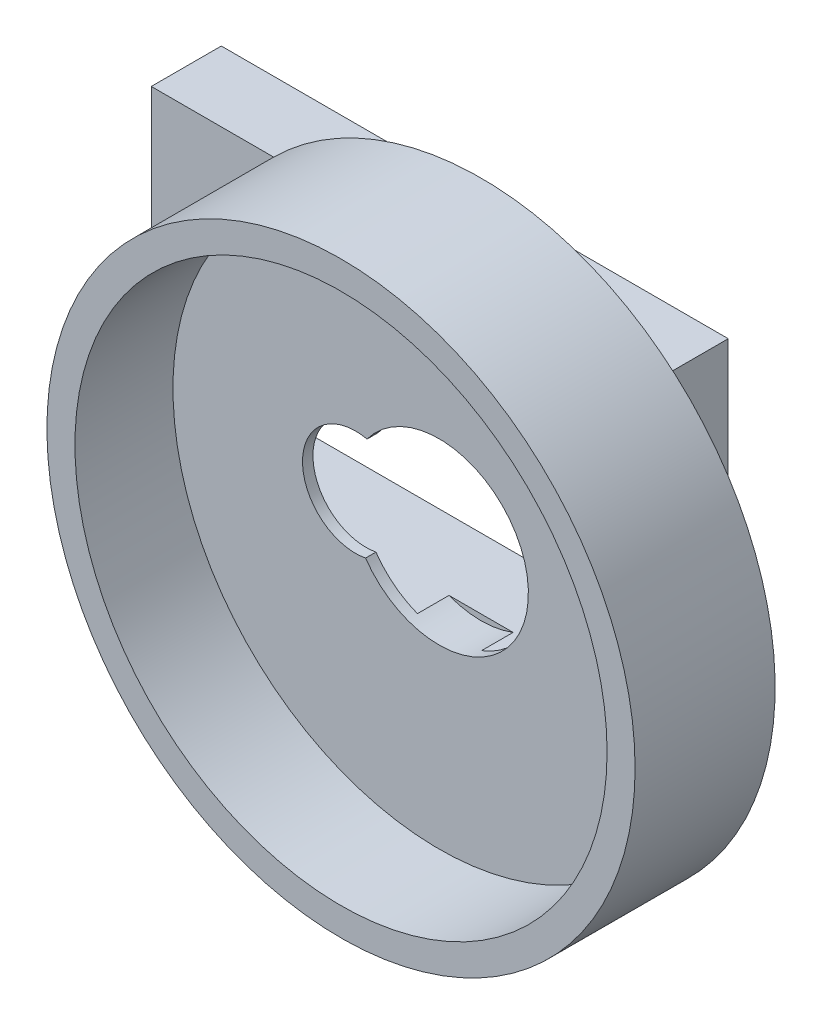
ISO-10303-21;
HEADER;
FILE_DESCRIPTION(('STEP AP214'),'2;1');
FILE_NAME('part.step','',(''),(''),'','','');
FILE_SCHEMA(('AUTOMOTIVE_DESIGN { 1 0 10303 214 1 1 1 1 }'));
ENDSEC;
DATA;
#1=APPLICATION_CONTEXT('core data for automotive mechanical design processes');
#2=APPLICATION_PROTOCOL_DEFINITION('international standard','automotive_design',2000,#1);
#3=PRODUCT_CONTEXT('',#1,'mechanical');
#4=PRODUCT('Part','Part','',(#3));
#5=PRODUCT_RELATED_PRODUCT_CATEGORY('part','',(#4));
#6=PRODUCT_DEFINITION_FORMATION('','',#4);
#7=PRODUCT_DEFINITION_CONTEXT('part definition',#1,'design');
#8=PRODUCT_DEFINITION('design','',#6,#7);
#9=PRODUCT_DEFINITION_SHAPE('','',#8);
#10=(LENGTH_UNIT() NAMED_UNIT(*) SI_UNIT(.MILLI.,.METRE.));
#11=(NAMED_UNIT(*) PLANE_ANGLE_UNIT() SI_UNIT($,.RADIAN.));
#12=(NAMED_UNIT(*) SI_UNIT($,.STERADIAN.) SOLID_ANGLE_UNIT());
#13=UNCERTAINTY_MEASURE_WITH_UNIT(LENGTH_MEASURE(1.E-05),#10,'distance_accuracy_value','');
#14=(GEOMETRIC_REPRESENTATION_CONTEXT(3) GLOBAL_UNCERTAINTY_ASSIGNED_CONTEXT((#13)) GLOBAL_UNIT_ASSIGNED_CONTEXT((#10,
#11,#12)) REPRESENTATION_CONTEXT('',''));
#15=CARTESIAN_POINT('',(0.,0.,0.));
#16=DIRECTION('',(0.,0.,1.));
#17=DIRECTION('',(1.,0.,0.));
#18=AXIS2_PLACEMENT_3D('',#15,#16,#17);
#19=CARTESIAN_POINT('',(21.0499987006187,-8.97299963980913,5.));
#20=DIRECTION('',(0.,-1.,0.));
#21=DIRECTION('',(0.,0.,-1.));
#22=AXIS2_PLACEMENT_3D('',#19,#20,#21);
#23=PLANE('',#22);
#24=DIRECTION('',(0.,0.,1.));
#25=VECTOR('',#24,1.);
#26=CARTESIAN_POINT('',(-0.00469983662826703,-8.97299963980913,7.25));
#27=LINE('',#26,#25);
#28=CARTESIAN_POINT('',(-0.00469983662826357,-8.97299963980913,7.25651338028399));
#29=VERTEX_POINT('',#28);
#30=CARTESIAN_POINT('',(-0.00469983662826703,-8.97299963980913,7.25));
#31=VERTEX_POINT('',#30);
#32=EDGE_CURVE('E59',#29,#31,#27,.F.);
#33=ORIENTED_EDGE('',*,*,#32,.T.);
#34=DIRECTION('',(-1.,0.,0.));
#35=VECTOR('',#34,1.);
#36=CARTESIAN_POINT('',(21.0499987006187,-8.97299963980913,7.25));
#37=LINE('',#36,#35);
#38=CARTESIAN_POINT('',(-0.0609952392290839,-8.97299963980913,7.25));
#39=VERTEX_POINT('',#38);
#40=EDGE_CURVE('E233',#31,#39,#37,.T.);
#41=ORIENTED_EDGE('',*,*,#40,.T.);
#42=DIRECTION('',(0.,0.,1.));
#43=VECTOR('',#42,1.);
#44=CARTESIAN_POINT('',(-0.0609952392290839,-8.97299963980913,5.));
#45=LINE('',#44,#43);
#46=CARTESIAN_POINT('',(-0.0609952392290752,-8.97299963980913,4.99999988824129));
#47=VERTEX_POINT('',#46);
#48=EDGE_CURVE('E400',#39,#47,#45,.F.);
#49=ORIENTED_EDGE('',*,*,#48,.T.);
#50=DIRECTION('',(-1.,0.,0.));
#51=VECTOR('',#50,1.);
#52=CARTESIAN_POINT('',(21.0499987006187,-8.97299963980913,5.));
#53=LINE('',#52,#51);
#54=CARTESIAN_POINT('',(-7.00300000607967,-8.97299963980913,5.));
#55=VERTEX_POINT('',#54);
#56=EDGE_CURVE('E324',#47,#55,#53,.T.);
#57=ORIENTED_EDGE('',*,*,#56,.T.);
#58=DIRECTION('',(0.,0.,1.));
#59=VECTOR('',#58,1.);
#60=CARTESIAN_POINT('',(-7.00300000607967,-8.97299963980913,1.5));
#61=LINE('',#60,#59);
#62=CARTESIAN_POINT('',(-7.00300000607967,-8.97299963980913,1.5));
#63=VERTEX_POINT('',#62);
#64=EDGE_CURVE('E302',#63,#55,#61,.T.);
#65=ORIENTED_EDGE('',*,*,#64,.F.);
#66=DIRECTION('',(-1.,0.,0.));
#67=VECTOR('',#66,1.);
#68=CARTESIAN_POINT('',(-12.002999894321,-8.97299963980913,1.5));
#69=LINE('',#68,#67);
#70=CARTESIAN_POINT('',(-12.002999894321,-8.97299963980913,1.5));
#71=VERTEX_POINT('',#70);
#72=EDGE_CURVE('E300',#63,#71,#69,.T.);
#73=ORIENTED_EDGE('',*,*,#72,.T.);
#74=DIRECTION('',(0.,0.,-1.));
#75=VECTOR('',#74,1.);
#76=CARTESIAN_POINT('',(-12.002999894321,-8.97299963980913,5.));
#77=LINE('',#76,#75);
#78=CARTESIAN_POINT('',(-12.002999894321,-8.97299963980913,0.));
#79=VERTEX_POINT('',#78);
#80=EDGE_CURVE('E345',#71,#79,#77,.T.);
#81=ORIENTED_EDGE('',*,*,#80,.T.);
#82=DIRECTION('',(-1.,0.,0.));
#83=VECTOR('',#82,1.);
#84=CARTESIAN_POINT('',(21.0499987006187,-8.97299963980913,0.));
#85=LINE('',#84,#83);
#86=CARTESIAN_POINT('',(21.0499987006187,-8.97299963980913,0.));
#87=VERTEX_POINT('',#86);
#88=EDGE_CURVE('E334',#87,#79,#85,.T.);
#89=ORIENTED_EDGE('',*,*,#88,.F.);
#90=DIRECTION('',(0.,0.,-1.));
#91=VECTOR('',#90,1.);
#92=CARTESIAN_POINT('',(21.0499987006187,-8.97299963980913,5.));
#93=LINE('',#92,#91);
#94=CARTESIAN_POINT('',(21.0499987006187,-8.97299963980913,1.5));
#95=VERTEX_POINT('',#94);
#96=EDGE_CURVE('E347',#95,#87,#93,.T.);
#97=ORIENTED_EDGE('',*,*,#96,.F.);
#98=DIRECTION('',(-1.,0.,0.));
#99=VECTOR('',#98,1.);
#100=CARTESIAN_POINT('',(21.0499987006187,-8.97299963980913,1.5));
#101=LINE('',#100,#99);
#102=CARTESIAN_POINT('',(16.4916390715284,-8.97299963980913,1.5));
#103=VERTEX_POINT('',#102);
#104=EDGE_CURVE('E310',#95,#103,#101,.T.);
#105=ORIENTED_EDGE('',*,*,#104,.T.);
#106=DIRECTION('',(0.,0.,1.));
#107=VECTOR('',#106,1.);
#108=CARTESIAN_POINT('',(16.4916390715284,-8.97299963980913,1.5));
#109=LINE('',#108,#107);
#110=CARTESIAN_POINT('',(16.4916390715284,-8.97299963980913,7.25651338028399));
#111=VERTEX_POINT('',#110);
#112=EDGE_CURVE('E317',#103,#111,#109,.T.);
#113=ORIENTED_EDGE('',*,*,#112,.T.);
#114=DIRECTION('',(-1.,0.,0.));
#115=VECTOR('',#114,1.);
#116=CARTESIAN_POINT('',(29.0677361462107,-8.97299963980913,7.25651338028399));
#117=LINE('',#116,#115);
#118=EDGE_CURVE('E268',#111,#29,#117,.T.);
#119=ORIENTED_EDGE('',*,*,#118,.T.);
#120=EDGE_LOOP('',(#33,#41,#49,#57,#65,#73,#81,#89,#97,#105,#113,#119));
#121=FACE_BOUND('',#120,.T.);
#122=ADVANCED_FACE('F44',(#121),#23,.T.);
#123=CARTESIAN_POINT('',(21.0499987006187,-21.3449988514185,5.));
#124=DIRECTION('',(0.,1.,0.));
#125=DIRECTION('',(0.,0.,1.));
#126=AXIS2_PLACEMENT_3D('',#123,#124,#125);
#127=PLANE('',#126);
#128=DIRECTION('',(0.,0.,1.));
#129=VECTOR('',#128,1.);
#130=CARTESIAN_POINT('',(-0.324902594661804,-21.3449988514185,5.));
#131=LINE('',#130,#129);
#132=CARTESIAN_POINT('',(-0.324902594661797,-21.3449988514185,4.99999988824129));
#133=VERTEX_POINT('',#132);
#134=CARTESIAN_POINT('',(-0.324902594661804,-21.3449988514185,7.25));
#135=VERTEX_POINT('',#134);
#136=EDGE_CURVE('E266',#133,#135,#131,.T.);
#137=ORIENTED_EDGE('',*,*,#136,.T.);
#138=DIRECTION('',(1.,0.,0.));
#139=VECTOR('',#138,1.);
#140=CARTESIAN_POINT('',(21.0499987006187,-21.3449988514185,7.25));
#141=LINE('',#140,#139);
#142=CARTESIAN_POINT('',(-0.269980564359586,-21.3449988514185,7.25));
#143=VERTEX_POINT('',#142);
#144=EDGE_CURVE('E67',#135,#143,#141,.T.);
#145=ORIENTED_EDGE('',*,*,#144,.T.);
#146=DIRECTION('',(0.,0.,1.));
#147=VECTOR('',#146,1.);
#148=CARTESIAN_POINT('',(-0.269980564359586,-21.3449988514185,7.25));
#149=LINE('',#148,#147);
#150=CARTESIAN_POINT('',(-0.269980564359586,-21.3449988514185,7.25651338028399));
#151=VERTEX_POINT('',#150);
#152=EDGE_CURVE('E228',#143,#151,#149,.T.);
#153=ORIENTED_EDGE('',*,*,#152,.T.);
#154=DIRECTION('',(-1.,0.,0.));
#155=VECTOR('',#154,1.);
#156=CARTESIAN_POINT('',(29.0677361462107,-21.3449988514185,7.25651338028399));
#157=LINE('',#156,#155);
#158=CARTESIAN_POINT('',(8.25926228249251,-21.3449988514185,7.25651338028399));
#159=VERTEX_POINT('',#158);
#160=EDGE_CURVE('E219',#159,#151,#157,.T.);
#161=ORIENTED_EDGE('',*,*,#160,.F.);
#162=DIRECTION('',(0.,0.,1.));
#163=VECTOR('',#162,1.);
#164=CARTESIAN_POINT('',(8.2592622824925,-21.3449988514185,5.));
#165=LINE('',#164,#163);
#166=CARTESIAN_POINT('',(8.25926228249251,-21.3449988514185,4.99999988824129));
#167=VERTEX_POINT('',#166);
#168=EDGE_CURVE('E398',#167,#159,#165,.T.);
#169=ORIENTED_EDGE('',*,*,#168,.F.);
#170=DIRECTION('',(1.,0.,0.));
#171=VECTOR('',#170,1.);
#172=CARTESIAN_POINT('',(21.0499987006187,-21.3449988514185,5.));
#173=LINE('',#172,#171);
#174=CARTESIAN_POINT('',(12.8376101178694,-21.3449988514185,4.99999988824129));
#175=VERTEX_POINT('',#174);
#176=EDGE_CURVE('E326',#167,#175,#173,.T.);
#177=ORIENTED_EDGE('',*,*,#176,.T.);
#178=DIRECTION('',(0.,0.,1.));
#179=VECTOR('',#178,1.);
#180=CARTESIAN_POINT('',(12.8376101178694,-21.3449988514185,5.));
#181=LINE('',#180,#179);
#182=CARTESIAN_POINT('',(12.8376101178694,-21.3449988514185,7.25651338028399));
#183=VERTEX_POINT('',#182);
#184=EDGE_CURVE('E396',#183,#175,#181,.F.);
#185=ORIENTED_EDGE('',*,*,#184,.F.);
#186=CARTESIAN_POINT('',(16.4916390715284,-21.3449988514185,7.25651338028399));
#187=VERTEX_POINT('',#186);
#188=EDGE_CURVE('E225',#187,#183,#157,.T.);
#189=ORIENTED_EDGE('',*,*,#188,.F.);
#190=DIRECTION('',(0.,0.,1.));
#191=VECTOR('',#190,1.);
#192=CARTESIAN_POINT('',(16.4916390715284,-21.3449988514185,1.5));
#193=LINE('',#192,#191);
#194=CARTESIAN_POINT('',(16.4916390715284,-21.3449988514185,1.5));
#195=VERTEX_POINT('',#194);
#196=EDGE_CURVE('E320',#195,#187,#193,.T.);
#197=ORIENTED_EDGE('',*,*,#196,.F.);
#198=DIRECTION('',(1.,0.,0.));
#199=VECTOR('',#198,1.);
#200=CARTESIAN_POINT('',(21.0499987006187,-21.3449988514185,1.5));
#201=LINE('',#200,#199);
#202=CARTESIAN_POINT('',(21.0499987006187,-21.3449988514185,1.5));
#203=VERTEX_POINT('',#202);
#204=EDGE_CURVE('E315',#195,#203,#201,.T.);
#205=ORIENTED_EDGE('',*,*,#204,.T.);
#206=DIRECTION('',(0.,0.,-1.));
#207=VECTOR('',#206,1.);
#208=CARTESIAN_POINT('',(21.0499987006187,-21.3449988514185,5.));
#209=LINE('',#208,#207);
#210=CARTESIAN_POINT('',(21.0499987006187,-21.3449988514185,0.));
#211=VERTEX_POINT('',#210);
#212=EDGE_CURVE('E331',#203,#211,#209,.T.);
#213=ORIENTED_EDGE('',*,*,#212,.T.);
#214=DIRECTION('',(1.,0.,0.));
#215=VECTOR('',#214,1.);
#216=CARTESIAN_POINT('',(21.0499987006187,-21.3449988514185,0.));
#217=LINE('',#216,#215);
#218=CARTESIAN_POINT('',(-12.002999894321,-21.3449988514185,0.));
#219=VERTEX_POINT('',#218);
#220=EDGE_CURVE('E327',#219,#211,#217,.T.);
#221=ORIENTED_EDGE('',*,*,#220,.F.);
#222=DIRECTION('',(0.,0.,-1.));
#223=VECTOR('',#222,1.);
#224=CARTESIAN_POINT('',(-12.002999894321,-21.3449988514185,5.));
#225=LINE('',#224,#223);
#226=CARTESIAN_POINT('',(-12.002999894321,-21.3449988514185,1.5));
#227=VERTEX_POINT('',#226);
#228=EDGE_CURVE('E343',#227,#219,#225,.T.);
#229=ORIENTED_EDGE('',*,*,#228,.F.);
#230=DIRECTION('',(1.,0.,0.));
#231=VECTOR('',#230,1.);
#232=CARTESIAN_POINT('',(21.0499987006187,-21.3449988514185,1.5));
#233=LINE('',#232,#231);
#234=CARTESIAN_POINT('',(-7.00300000607967,-21.3449988514185,1.5));
#235=VERTEX_POINT('',#234);
#236=EDGE_CURVE('E385',#227,#235,#233,.T.);
#237=ORIENTED_EDGE('',*,*,#236,.T.);
#238=DIRECTION('',(0.,0.,-1.));
#239=VECTOR('',#238,1.);
#240=CARTESIAN_POINT('',(-7.00300000607967,-21.3449988514185,5.));
#241=LINE('',#240,#239);
#242=CARTESIAN_POINT('',(-7.00300000607967,-21.3449988514185,5.));
#243=VERTEX_POINT('',#242);
#244=EDGE_CURVE('E294',#243,#235,#241,.T.);
#245=ORIENTED_EDGE('',*,*,#244,.F.);
#246=EDGE_CURVE('E328',#243,#133,#173,.T.);
#247=ORIENTED_EDGE('',*,*,#246,.T.);
#248=EDGE_LOOP('',(#137,#145,#153,#161,#169,#177,#185,#189,#197,#205,#213,#221,#229,#237,#245,#247));
#249=FACE_BOUND('',#248,.T.);
#250=ADVANCED_FACE('F229',(#249),#127,.T.);
#251=CARTESIAN_POINT('',(10.5484362001809,-15.3881239401325,5.));
#252=DIRECTION('',(0.,0.,1.));
#253=DIRECTION('',(1.,0.,0.));
#254=AXIS2_PLACEMENT_3D('',#251,#252,#253);
#255=CYLINDRICAL_SURFACE('',#254,12.3981391852221);
#256=ORIENTED_EDGE('',*,*,#48,.F.);
#257=CARTESIAN_POINT('',(10.5484362001809,-15.3881239401325,7.25));
#258=DIRECTION('',(0.,0.,1.));
#259=DIRECTION('',(1.,0.,0.));
#260=AXIS2_PLACEMENT_3D('',#257,#258,#259);
#261=CIRCLE('',#260,12.3981391852221);
#262=EDGE_CURVE('E405',#39,#135,#261,.F.);
#263=ORIENTED_EDGE('',*,*,#262,.T.);
#264=ORIENTED_EDGE('',*,*,#136,.F.);
#265=CARTESIAN_POINT('',(10.5484362001809,-15.3881239401325,5.));
#266=DIRECTION('',(0.,0.,1.));
#267=DIRECTION('',(1.,0.,0.));
#268=AXIS2_PLACEMENT_3D('',#265,#266,#267);
#269=CIRCLE('',#268,12.3981391852221);
#270=EDGE_CURVE('E291',#133,#47,#269,.T.);
#271=ORIENTED_EDGE('',*,*,#270,.T.);
#272=EDGE_LOOP('',(#256,#263,#264,#271));
#273=FACE_BOUND('',#272,.T.);
#274=ADVANCED_FACE('F416',(#273),#255,.T.);
#275=CARTESIAN_POINT('',(29.0677361462107,-8.97299963980913,7.25651338028399));
#276=DIRECTION('',(0.,0.,1.));
#277=DIRECTION('',(0.,-1.,0.));
#278=AXIS2_PLACEMENT_3D('',#275,#276,#277);
#279=PLANE('',#278);
#280=CARTESIAN_POINT('',(10.5484362001809,-15.3881239401325,7.25651338028399));
#281=DIRECTION('',(0.,0.,1.));
#282=DIRECTION('',(0.,-1.,0.));
#283=AXIS2_PLACEMENT_3D('',#280,#281,#282);
#284=CIRCLE('',#283,12.35);
#285=EDGE_CURVE('E12',#29,#151,#284,.T.);
#286=ORIENTED_EDGE('',*,*,#285,.F.);
#287=ORIENTED_EDGE('',*,*,#118,.F.);
#288=DIRECTION('',(0.,-1.,0.));
#289=VECTOR('',#288,1.);
#290=CARTESIAN_POINT('',(16.4916390715284,-8.97299963980913,7.25651338028399));
#291=LINE('',#290,#289);
#292=CARTESIAN_POINT('',(16.4916390715284,-13.0636851768735,7.25651338028399));
#293=VERTEX_POINT('',#292);
#294=EDGE_CURVE('E263',#111,#293,#291,.T.);
#295=ORIENTED_EDGE('',*,*,#294,.T.);
#296=CARTESIAN_POINT('',(10.5484362001809,-15.3881239401325,7.25651338028399));
#297=DIRECTION('',(0.,0.,1.));
#298=DIRECTION('',(0.,-1.,0.));
#299=AXIS2_PLACEMENT_3D('',#296,#297,#298);
#300=CIRCLE('',#299,6.38158882521694);
#301=CARTESIAN_POINT('',(5.40874854801351,-11.6054943293602,7.25651338028399));
#302=VERTEX_POINT('',#301);
#303=EDGE_CURVE('E390',#302,#293,#300,.F.);
#304=ORIENTED_EDGE('',*,*,#303,.F.);
#305=CARTESIAN_POINT('',(4.58533255899476,-15.2999996207654,7.25651338028399));
#306=DIRECTION('',(0.,0.,1.));
#307=DIRECTION('',(0.,-1.,0.));
#308=AXIS2_PLACEMENT_3D('',#305,#306,#307);
#309=CIRCLE('',#308,3.78515300076408);
#310=CARTESIAN_POINT('',(5.29921605781776,-19.0172235297198,7.25651338028399));
#311=VERTEX_POINT('',#310);
#312=EDGE_CURVE('E272',#311,#302,#309,.F.);
#313=ORIENTED_EDGE('',*,*,#312,.F.);
#314=EDGE_CURVE('E223',#159,#311,#300,.F.);
#315=ORIENTED_EDGE('',*,*,#314,.F.);
#316=ORIENTED_EDGE('',*,*,#160,.T.);
#317=EDGE_LOOP('',(#286,#287,#295,#304,#313,#315,#316));
#318=FACE_BOUND('',#317,.T.);
#319=ADVANCED_FACE('F220',(#318),#279,.F.);
#320=CARTESIAN_POINT('',(10.5484362001809,-15.3881239401325,15.));
#321=DIRECTION('',(0.,0.,-1.));
#322=DIRECTION('',(-1.,0.,0.));
#323=AXIS2_PLACEMENT_3D('',#320,#321,#322);
#324=CYLINDRICAL_SURFACE('',#323,19.);
#325=CARTESIAN_POINT('',(10.5484362001809,-15.3881239401325,5.));
#326=DIRECTION('',(0.,0.,1.));
#327=DIRECTION('',(1.,0.,0.));
#328=AXIS2_PLACEMENT_3D('',#325,#326,#327);
#329=CIRCLE('',#328,19.);
#330=CARTESIAN_POINT('',(23.2000015676022,-1.21286754901674,5.));
#331=VERTEX_POINT('',#330);
#332=CARTESIAN_POINT('',(22.3528322563289,-0.500000023748726,5.));
#333=VERTEX_POINT('',#332);
#334=EDGE_CURVE('E242',#331,#333,#329,.T.);
#335=ORIENTED_EDGE('',*,*,#334,.F.);
#336=CARTESIAN_POINT('',(23.2000015676022,-29.5633803312482,5.));
#337=VERTEX_POINT('',#336);
#338=EDGE_CURVE('E237',#337,#331,#329,.T.);
#339=ORIENTED_EDGE('',*,*,#338,.F.);
#340=CARTESIAN_POINT('',(22.6931098313298,-29.9999993294477,5.));
#341=VERTEX_POINT('',#340);
#342=EDGE_CURVE('E240',#341,#337,#329,.T.);
#343=ORIENTED_EDGE('',*,*,#342,.F.);
#344=CARTESIAN_POINT('',(-1.59623743096794,-29.9999993294477,5.));
#345=VERTEX_POINT('',#344);
#346=EDGE_CURVE('E492',#345,#341,#329,.T.);
#347=ORIENTED_EDGE('',*,*,#346,.F.);
#348=CARTESIAN_POINT('',(-1.25595985596705,-0.500000023748725,5.));
#349=VERTEX_POINT('',#348);
#350=EDGE_CURVE('E500',#349,#345,#329,.T.);
#351=ORIENTED_EDGE('',*,*,#350,.F.);
#352=EDGE_CURVE('E250',#333,#349,#329,.T.);
#353=ORIENTED_EDGE('',*,*,#352,.F.);
#354=EDGE_LOOP('',(#335,#339,#343,#347,#351,#353));
#355=FACE_BOUND('',#354,.T.);
#356=CARTESIAN_POINT('',(10.5484362001809,-15.3881239401325,7.25));
#357=DIRECTION('',(0.,0.,1.));
#358=DIRECTION('',(1.,0.,0.));
#359=AXIS2_PLACEMENT_3D('',#356,#357,#358);
#360=CIRCLE('',#359,19.);
#361=CARTESIAN_POINT('',(29.5484362001809,-15.3881239401325,7.25));
#362=VERTEX_POINT('',#361);
#363=EDGE_CURVE('E403',#362,#362,#360,.T.);
#364=ORIENTED_EDGE('',*,*,#363,.T.);
#365=EDGE_LOOP('',(#364));
#366=FACE_BOUND('',#365,.T.);
#367=ADVANCED_FACE('F431',(#355,#366),#324,.F.);
#368=CARTESIAN_POINT('',(0.,0.,5.));
#369=DIRECTION('',(0.,0.,1.));
#370=DIRECTION('',(1.,0.,0.));
#371=AXIS2_PLACEMENT_3D('',#368,#369,#370);
#372=PLANE('',#371);
#373=DIRECTION('',(0.,1.,0.));
#374=VECTOR('',#373,1.);
#375=CARTESIAN_POINT('',(-7.00300000607967,-8.97299963980913,5.));
#376=LINE('',#375,#374);
#377=EDGE_CURVE('E289',#243,#55,#376,.T.);
#378=ORIENTED_EDGE('',*,*,#377,.T.);
#379=ORIENTED_EDGE('',*,*,#56,.F.);
#380=ORIENTED_EDGE('',*,*,#270,.F.);
#381=ORIENTED_EDGE('',*,*,#246,.F.);
#382=EDGE_LOOP('',(#378,#379,#380,#381));
#383=FACE_BOUND('',#382,.T.);
#384=ORIENTED_EDGE('',*,*,#342,.T.);
#385=DIRECTION('',(0.,1.,0.));
#386=VECTOR('',#385,1.);
#387=CARTESIAN_POINT('',(23.2000015676022,-0.500000023748725,5.));
#388=LINE('',#387,#386);
#389=EDGE_CURVE('E357',#337,#331,#388,.T.);
#390=ORIENTED_EDGE('',*,*,#389,.T.);
#391=ORIENTED_EDGE('',*,*,#334,.T.);
#392=DIRECTION('',(-1.,0.,0.));
#393=VECTOR('',#392,1.);
#394=CARTESIAN_POINT('',(-13.0000002682209,-0.500000023748725,5.));
#395=LINE('',#394,#393);
#396=EDGE_CURVE('E366',#333,#349,#395,.T.);
#397=ORIENTED_EDGE('',*,*,#396,.T.);
#398=ORIENTED_EDGE('',*,*,#350,.T.);
#399=DIRECTION('',(1.,0.,0.));
#400=VECTOR('',#399,1.);
#401=CARTESIAN_POINT('',(-13.0000002682209,-29.9999993294477,5.));
#402=LINE('',#401,#400);
#403=EDGE_CURVE('E352',#345,#341,#402,.T.);
#404=ORIENTED_EDGE('',*,*,#403,.T.);
#405=EDGE_LOOP('',(#384,#390,#391,#397,#398,#404));
#406=FACE_BOUND('',#405,.T.);
#407=ADVANCED_FACE('F448',(#383,#406),#372,.T.);
#408=CARTESIAN_POINT('',(-13.0000002682209,-29.9999993294477,5.));
#409=VERTEX_POINT('',#408);
#410=CARTESIAN_POINT('',(-4.53443811498601,-29.9999993294477,5.));
#411=VERTEX_POINT('',#410);
#412=EDGE_CURVE('E354',#409,#411,#402,.T.);
#413=ORIENTED_EDGE('',*,*,#412,.T.);
#414=CARTESIAN_POINT('',(10.5484362001809,-15.3881239401325,5.));
#415=DIRECTION('',(0.,0.,1.));
#416=DIRECTION('',(1.,0.,0.));
#417=AXIS2_PLACEMENT_3D('',#414,#415,#416);
#418=CIRCLE('',#417,21.);
#419=CARTESIAN_POINT('',(-4.26182261762512,-0.500000023748726,5.));
#420=VERTEX_POINT('',#419);
#421=EDGE_CURVE('E255',#420,#411,#418,.T.);
#422=ORIENTED_EDGE('',*,*,#421,.F.);
#423=CARTESIAN_POINT('',(-13.0000002682209,-0.500000023748725,5.));
#424=VERTEX_POINT('',#423);
#425=EDGE_CURVE('E361',#420,#424,#395,.T.);
#426=ORIENTED_EDGE('',*,*,#425,.T.);
#427=DIRECTION('',(0.,-1.,0.));
#428=VECTOR('',#427,1.);
#429=CARTESIAN_POINT('',(-13.0000002682209,-0.500000023748725,5.));
#430=LINE('',#429,#428);
#431=EDGE_CURVE('E350',#424,#409,#430,.T.);
#432=ORIENTED_EDGE('',*,*,#431,.T.);
#433=EDGE_LOOP('',(#413,#422,#426,#432));
#434=FACE_BOUND('',#433,.T.);
#435=ADVANCED_FACE('F451',(#434),#372,.T.);
#436=ORIENTED_EDGE('',*,*,#176,.F.);
#437=CARTESIAN_POINT('',(10.5484362001809,-15.3881239401325,5.));
#438=DIRECTION('',(0.,0.,1.));
#439=DIRECTION('',(1.,0.,0.));
#440=AXIS2_PLACEMENT_3D('',#437,#438,#439);
#441=CIRCLE('',#440,6.38158882521694);
#442=EDGE_CURVE('E282',#167,#175,#441,.T.);
#443=ORIENTED_EDGE('',*,*,#442,.T.);
#444=EDGE_LOOP('',(#436,#443));
#445=FACE_BOUND('',#444,.T.);
#446=ADVANCED_FACE('F572',(#445),#372,.T.);
#447=DIRECTION('',(0.,-1.,0.));
#448=VECTOR('',#447,1.);
#449=CARTESIAN_POINT('',(16.4916390715284,-8.97299963980913,5.));
#450=LINE('',#449,#448);
#451=CARTESIAN_POINT('',(16.4916390715284,-13.0636851768735,5.));
#452=VERTEX_POINT('',#451);
#453=CARTESIAN_POINT('',(16.4916390715284,-17.7125627033915,4.99999988824129));
#454=VERTEX_POINT('',#453);
#455=EDGE_CURVE('E307',#452,#454,#450,.T.);
#456=ORIENTED_EDGE('',*,*,#455,.T.);
#457=EDGE_CURVE('E286',#454,#452,#441,.T.);
#458=ORIENTED_EDGE('',*,*,#457,.T.);
#459=EDGE_LOOP('',(#456,#458));
#460=FACE_BOUND('',#459,.T.);
#461=ADVANCED_FACE('F453',(#460),#372,.T.);
#462=CARTESIAN_POINT('',(-12.002999894321,-8.97299963980913,5.));
#463=DIRECTION('',(1.,0.,0.));
#464=DIRECTION('',(0.,0.,-1.));
#465=AXIS2_PLACEMENT_3D('',#462,#463,#464);
#466=PLANE('',#465);
#467=ORIENTED_EDGE('',*,*,#80,.F.);
#468=DIRECTION('',(0.,-1.,0.));
#469=VECTOR('',#468,1.);
#470=CARTESIAN_POINT('',(-12.002999894321,-8.97299963980913,1.5));
#471=LINE('',#470,#469);
#472=EDGE_CURVE('E295',#71,#227,#471,.T.);
#473=ORIENTED_EDGE('',*,*,#472,.T.);
#474=ORIENTED_EDGE('',*,*,#228,.T.);
#475=DIRECTION('',(0.,-1.,0.));
#476=VECTOR('',#475,1.);
#477=CARTESIAN_POINT('',(-12.002999894321,-8.97299963980913,0.));
#478=LINE('',#477,#476);
#479=EDGE_CURVE('E337',#79,#219,#478,.T.);
#480=ORIENTED_EDGE('',*,*,#479,.F.);
#481=EDGE_LOOP('',(#467,#473,#474,#480));
#482=FACE_BOUND('',#481,.T.);
#483=ADVANCED_FACE('F441',(#482),#466,.T.);
#484=CARTESIAN_POINT('',(0.,0.,0.));
#485=DIRECTION('',(0.,0.,1.));
#486=DIRECTION('',(1.,0.,0.));
#487=AXIS2_PLACEMENT_3D('',#484,#485,#486);
#488=PLANE('',#487);
#489=DIRECTION('',(0.,-1.,0.));
#490=VECTOR('',#489,1.);
#491=CARTESIAN_POINT('',(-13.0000002682209,-0.500000023748725,0.));
#492=LINE('',#491,#490);
#493=CARTESIAN_POINT('',(-13.0000002682209,-0.500000023748725,0.));
#494=VERTEX_POINT('',#493);
#495=CARTESIAN_POINT('',(-13.0000002682209,-29.9999993294477,0.));
#496=VERTEX_POINT('',#495);
#497=EDGE_CURVE('E349',#494,#496,#492,.T.);
#498=ORIENTED_EDGE('',*,*,#497,.F.);
#499=DIRECTION('',(-1.,0.,0.));
#500=VECTOR('',#499,1.);
#501=CARTESIAN_POINT('',(-13.0000002682209,-0.500000023748725,0.));
#502=LINE('',#501,#500);
#503=CARTESIAN_POINT('',(23.2000015676022,-0.500000023748725,0.));
#504=VERTEX_POINT('',#503);
#505=EDGE_CURVE('E353',#504,#494,#502,.T.);
#506=ORIENTED_EDGE('',*,*,#505,.F.);
#507=DIRECTION('',(0.,1.,0.));
#508=VECTOR('',#507,1.);
#509=CARTESIAN_POINT('',(23.2000015676022,-0.500000023748725,0.));
#510=LINE('',#509,#508);
#511=CARTESIAN_POINT('',(23.2000015676022,-29.9999993294477,0.));
#512=VERTEX_POINT('',#511);
#513=EDGE_CURVE('E371',#512,#504,#510,.T.);
#514=ORIENTED_EDGE('',*,*,#513,.F.);
#515=DIRECTION('',(1.,0.,0.));
#516=VECTOR('',#515,1.);
#517=CARTESIAN_POINT('',(-13.0000002682209,-29.9999993294477,0.));
#518=LINE('',#517,#516);
#519=EDGE_CURVE('E369',#496,#512,#518,.T.);
#520=ORIENTED_EDGE('',*,*,#519,.F.);
#521=EDGE_LOOP('',(#498,#506,#514,#520));
#522=FACE_BOUND('',#521,.T.);
#523=DIRECTION('',(0.,1.,0.));
#524=VECTOR('',#523,1.);
#525=CARTESIAN_POINT('',(21.0499987006187,-8.97299963980913,0.));
#526=LINE('',#525,#524);
#527=EDGE_CURVE('E322',#211,#87,#526,.T.);
#528=ORIENTED_EDGE('',*,*,#527,.T.);
#529=ORIENTED_EDGE('',*,*,#88,.T.);
#530=ORIENTED_EDGE('',*,*,#479,.T.);
#531=ORIENTED_EDGE('',*,*,#220,.T.);
#532=EDGE_LOOP('',(#528,#529,#530,#531));
#533=FACE_BOUND('',#532,.T.);
#534=ADVANCED_FACE('F454',(#522,#533),#488,.F.);
#535=CARTESIAN_POINT('',(-13.0000002682209,-0.500000023748725,5.));
#536=DIRECTION('',(1.,0.,0.));
#537=DIRECTION('',(0.,0.,-1.));
#538=AXIS2_PLACEMENT_3D('',#535,#536,#537);
#539=PLANE('',#538);
#540=ORIENTED_EDGE('',*,*,#497,.T.);
#541=DIRECTION('',(0.,0.,-1.));
#542=VECTOR('',#541,1.);
#543=CARTESIAN_POINT('',(-13.0000002682209,-29.9999993294477,5.));
#544=LINE('',#543,#542);
#545=EDGE_CURVE('E382',#409,#496,#544,.T.);
#546=ORIENTED_EDGE('',*,*,#545,.F.);
#547=ORIENTED_EDGE('',*,*,#431,.F.);
#548=DIRECTION('',(0.,0.,-1.));
#549=VECTOR('',#548,1.);
#550=CARTESIAN_POINT('',(-13.0000002682209,-0.500000023748725,5.));
#551=LINE('',#550,#549);
#552=EDGE_CURVE('E365',#424,#494,#551,.T.);
#553=ORIENTED_EDGE('',*,*,#552,.T.);
#554=EDGE_LOOP('',(#540,#546,#547,#553));
#555=FACE_BOUND('',#554,.T.);
#556=ADVANCED_FACE('F46',(#555),#539,.F.);
#557=CARTESIAN_POINT('',(-13.0000002682209,-29.9999993294477,5.));
#558=DIRECTION('',(0.,1.,0.));
#559=DIRECTION('',(0.,0.,1.));
#560=AXIS2_PLACEMENT_3D('',#557,#558,#559);
#561=PLANE('',#560);
#562=ORIENTED_EDGE('',*,*,#519,.T.);
#563=DIRECTION('',(0.,0.,-1.));
#564=VECTOR('',#563,1.);
#565=CARTESIAN_POINT('',(23.2000015676022,-29.9999993294477,5.));
#566=LINE('',#565,#564);
#567=CARTESIAN_POINT('',(23.2000015676022,-29.9999993294477,5.));
#568=VERTEX_POINT('',#567);
#569=EDGE_CURVE('E379',#568,#512,#566,.T.);
#570=ORIENTED_EDGE('',*,*,#569,.F.);
#571=DIRECTION('',(1.,0.,0.));
#572=VECTOR('',#571,1.);
#573=CARTESIAN_POINT('',(-13.0000002682209,-29.9999993294477,5.));
#574=LINE('',#573,#572);
#575=EDGE_CURVE('E260',#341,#568,#574,.T.);
#576=ORIENTED_EDGE('',*,*,#575,.F.);
#577=ORIENTED_EDGE('',*,*,#403,.F.);
#578=EDGE_CURVE('E226',#411,#345,#574,.T.);
#579=ORIENTED_EDGE('',*,*,#578,.F.);
#580=ORIENTED_EDGE('',*,*,#412,.F.);
#581=ORIENTED_EDGE('',*,*,#545,.T.);
#582=EDGE_LOOP('',(#562,#570,#576,#577,#579,#580,#581));
#583=FACE_BOUND('',#582,.T.);
#584=ADVANCED_FACE('F463',(#583),#561,.F.);
#585=CARTESIAN_POINT('',(23.2000015676022,-0.500000023748725,5.));
#586=DIRECTION('',(-1.,0.,0.));
#587=DIRECTION('',(0.,0.,1.));
#588=AXIS2_PLACEMENT_3D('',#585,#586,#587);
#589=PLANE('',#588);
#590=ORIENTED_EDGE('',*,*,#513,.T.);
#591=DIRECTION('',(0.,0.,-1.));
#592=VECTOR('',#591,1.);
#593=CARTESIAN_POINT('',(23.2000015676022,-0.500000023748725,5.));
#594=LINE('',#593,#592);
#595=CARTESIAN_POINT('',(23.2000015676022,-0.500000023748725,5.));
#596=VERTEX_POINT('',#595);
#597=EDGE_CURVE('E376',#596,#504,#594,.T.);
#598=ORIENTED_EDGE('',*,*,#597,.F.);
#599=DIRECTION('',(0.,1.,0.));
#600=VECTOR('',#599,1.);
#601=CARTESIAN_POINT('',(23.2000015676022,-0.500000023748725,5.));
#602=LINE('',#601,#600);
#603=EDGE_CURVE('E254',#331,#596,#602,.T.);
#604=ORIENTED_EDGE('',*,*,#603,.F.);
#605=ORIENTED_EDGE('',*,*,#389,.F.);
#606=EDGE_CURVE('E358',#568,#337,#388,.T.);
#607=ORIENTED_EDGE('',*,*,#606,.F.);
#608=ORIENTED_EDGE('',*,*,#569,.T.);
#609=EDGE_LOOP('',(#590,#598,#604,#605,#607,#608));
#610=FACE_BOUND('',#609,.T.);
#611=ADVANCED_FACE('F460',(#610),#589,.F.);
#612=CARTESIAN_POINT('',(-13.0000002682209,-0.500000023748725,5.));
#613=DIRECTION('',(0.,-1.,0.));
#614=DIRECTION('',(0.,0.,-1.));
#615=AXIS2_PLACEMENT_3D('',#612,#613,#614);
#616=PLANE('',#615);
#617=ORIENTED_EDGE('',*,*,#505,.T.);
#618=ORIENTED_EDGE('',*,*,#552,.F.);
#619=ORIENTED_EDGE('',*,*,#425,.F.);
#620=EDGE_CURVE('E507',#349,#420,#395,.T.);
#621=ORIENTED_EDGE('',*,*,#620,.F.);
#622=ORIENTED_EDGE('',*,*,#396,.F.);
#623=EDGE_CURVE('E362',#596,#333,#395,.T.);
#624=ORIENTED_EDGE('',*,*,#623,.F.);
#625=ORIENTED_EDGE('',*,*,#597,.T.);
#626=EDGE_LOOP('',(#617,#618,#619,#621,#622,#624,#625));
#627=FACE_BOUND('',#626,.T.);
#628=ADVANCED_FACE('F446',(#627),#616,.F.);
#629=CARTESIAN_POINT('',(21.0499987006187,-8.97299963980913,5.));
#630=DIRECTION('',(-1.,0.,0.));
#631=DIRECTION('',(0.,0.,1.));
#632=AXIS2_PLACEMENT_3D('',#629,#630,#631);
#633=PLANE('',#632);
#634=DIRECTION('',(0.,1.,0.));
#635=VECTOR('',#634,1.);
#636=CARTESIAN_POINT('',(21.0499987006187,-8.97299963980913,1.5));
#637=LINE('',#636,#635);
#638=EDGE_CURVE('E308',#203,#95,#637,.T.);
#639=ORIENTED_EDGE('',*,*,#638,.T.);
#640=ORIENTED_EDGE('',*,*,#96,.T.);
#641=ORIENTED_EDGE('',*,*,#527,.F.);
#642=ORIENTED_EDGE('',*,*,#212,.F.);
#643=EDGE_LOOP('',(#639,#640,#641,#642));
#644=FACE_BOUND('',#643,.T.);
#645=ADVANCED_FACE('F442',(#644),#633,.T.);
#646=CARTESIAN_POINT('',(16.4916390715284,-8.97299963980913,1.5));
#647=DIRECTION('',(-1.,0.,0.));
#648=DIRECTION('',(0.,0.,1.));
#649=AXIS2_PLACEMENT_3D('',#646,#647,#648);
#650=PLANE('',#649);
#651=ORIENTED_EDGE('',*,*,#455,.F.);
#652=DIRECTION('',(0.,0.,1.));
#653=VECTOR('',#652,1.);
#654=CARTESIAN_POINT('',(16.4916390715284,-13.0636851768735,5.));
#655=LINE('',#654,#653);
#656=EDGE_CURVE('E285',#452,#293,#655,.T.);
#657=ORIENTED_EDGE('',*,*,#656,.T.);
#658=ORIENTED_EDGE('',*,*,#294,.F.);
#659=ORIENTED_EDGE('',*,*,#112,.F.);
#660=DIRECTION('',(0.,-1.,0.));
#661=VECTOR('',#660,1.);
#662=CARTESIAN_POINT('',(16.4916390715284,-8.97299963980913,1.5));
#663=LINE('',#662,#661);
#664=EDGE_CURVE('E312',#103,#195,#663,.T.);
#665=ORIENTED_EDGE('',*,*,#664,.T.);
#666=ORIENTED_EDGE('',*,*,#196,.T.);
#667=CARTESIAN_POINT('',(16.4916390715284,-17.7125627033915,7.25651338028399));
#668=VERTEX_POINT('',#667);
#669=EDGE_CURVE('E267',#668,#187,#291,.T.);
#670=ORIENTED_EDGE('',*,*,#669,.F.);
#671=DIRECTION('',(0.,0.,1.));
#672=VECTOR('',#671,1.);
#673=CARTESIAN_POINT('',(16.4916390715284,-17.7125627033915,5.));
#674=LINE('',#673,#672);
#675=EDGE_CURVE('E393',#668,#454,#674,.F.);
#676=ORIENTED_EDGE('',*,*,#675,.T.);
#677=EDGE_LOOP('',(#651,#657,#658,#659,#665,#666,#670,#676));
#678=FACE_BOUND('',#677,.T.);
#679=ADVANCED_FACE('F445',(#678),#650,.T.);
#680=CARTESIAN_POINT('',(0.,0.,1.5));
#681=DIRECTION('',(0.,0.,-1.));
#682=DIRECTION('',(-1.,0.,0.));
#683=AXIS2_PLACEMENT_3D('',#680,#681,#682);
#684=PLANE('',#683);
#685=ORIENTED_EDGE('',*,*,#638,.F.);
#686=ORIENTED_EDGE('',*,*,#204,.F.);
#687=ORIENTED_EDGE('',*,*,#664,.F.);
#688=ORIENTED_EDGE('',*,*,#104,.F.);
#689=EDGE_LOOP('',(#685,#686,#687,#688));
#690=FACE_BOUND('',#689,.T.);
#691=ADVANCED_FACE('F544',(#690),#684,.T.);
#692=CARTESIAN_POINT('',(-7.00300000607967,-8.97299963980913,1.5));
#693=DIRECTION('',(1.,0.,0.));
#694=DIRECTION('',(0.,0.,-1.));
#695=AXIS2_PLACEMENT_3D('',#692,#693,#694);
#696=PLANE('',#695);
#697=ORIENTED_EDGE('',*,*,#377,.F.);
#698=ORIENTED_EDGE('',*,*,#244,.T.);
#699=DIRECTION('',(0.,1.,0.));
#700=VECTOR('',#699,1.);
#701=CARTESIAN_POINT('',(-7.00300000607967,-8.97299963980913,1.5));
#702=LINE('',#701,#700);
#703=EDGE_CURVE('E297',#235,#63,#702,.T.);
#704=ORIENTED_EDGE('',*,*,#703,.T.);
#705=ORIENTED_EDGE('',*,*,#64,.T.);
#706=EDGE_LOOP('',(#697,#698,#704,#705));
#707=FACE_BOUND('',#706,.T.);
#708=ADVANCED_FACE('F540',(#707),#696,.T.);
#709=CARTESIAN_POINT('',(0.,0.,1.5));
#710=DIRECTION('',(0.,0.,1.));
#711=DIRECTION('',(1.,0.,0.));
#712=AXIS2_PLACEMENT_3D('',#709,#710,#711);
#713=PLANE('',#712);
#714=ORIENTED_EDGE('',*,*,#236,.F.);
#715=ORIENTED_EDGE('',*,*,#472,.F.);
#716=ORIENTED_EDGE('',*,*,#72,.F.);
#717=ORIENTED_EDGE('',*,*,#703,.F.);
#718=EDGE_LOOP('',(#714,#715,#716,#717));
#719=FACE_BOUND('',#718,.T.);
#720=ADVANCED_FACE('F534',(#719),#713,.F.);
#721=CARTESIAN_POINT('',(4.58533255899476,-15.2999996207654,5.));
#722=DIRECTION('',(0.,0.,1.));
#723=DIRECTION('',(1.,0.,0.));
#724=AXIS2_PLACEMENT_3D('',#721,#722,#723);
#725=CYLINDRICAL_SURFACE('',#724,3.78515300076408);
#726=DIRECTION('',(0.,0.,1.));
#727=VECTOR('',#726,1.);
#728=CARTESIAN_POINT('',(5.29921605781776,-19.0172235297198,5.));
#729=LINE('',#728,#727);
#730=CARTESIAN_POINT('',(5.29921605781776,-19.0172235297198,8.));
#731=VERTEX_POINT('',#730);
#732=EDGE_CURVE('E281',#311,#731,#729,.T.);
#733=ORIENTED_EDGE('',*,*,#732,.F.);
#734=ORIENTED_EDGE('',*,*,#312,.T.);
#735=DIRECTION('',(0.,0.,1.));
#736=VECTOR('',#735,1.);
#737=CARTESIAN_POINT('',(5.40874854801351,-11.6054943293602,5.));
#738=LINE('',#737,#736);
#739=CARTESIAN_POINT('',(5.40874854801351,-11.6054943293602,8.));
#740=VERTEX_POINT('',#739);
#741=EDGE_CURVE('E287',#302,#740,#738,.T.);
#742=ORIENTED_EDGE('',*,*,#741,.T.);
#743=CARTESIAN_POINT('',(4.58533255899476,-15.2999996207654,8.));
#744=DIRECTION('',(0.,0.,1.));
#745=DIRECTION('',(1.,0.,0.));
#746=AXIS2_PLACEMENT_3D('',#743,#744,#745);
#747=CIRCLE('',#746,3.78515300076408);
#748=EDGE_CURVE('E275',#740,#731,#747,.T.);
#749=ORIENTED_EDGE('',*,*,#748,.T.);
#750=EDGE_LOOP('',(#733,#734,#742,#749));
#751=FACE_BOUND('',#750,.T.);
#752=ADVANCED_FACE('F530',(#751),#725,.F.);
#753=CARTESIAN_POINT('',(10.5484362001809,-15.3881239401325,5.));
#754=DIRECTION('',(0.,0.,1.));
#755=DIRECTION('',(1.,0.,0.));
#756=AXIS2_PLACEMENT_3D('',#753,#754,#755);
#757=CYLINDRICAL_SURFACE('',#756,6.38158882521694);
#758=ORIENTED_EDGE('',*,*,#168,.T.);
#759=ORIENTED_EDGE('',*,*,#314,.T.);
#760=ORIENTED_EDGE('',*,*,#732,.T.);
#761=CARTESIAN_POINT('',(10.5484362001809,-15.3881239401325,8.));
#762=DIRECTION('',(0.,0.,1.));
#763=DIRECTION('',(1.,0.,0.));
#764=AXIS2_PLACEMENT_3D('',#761,#762,#763);
#765=CIRCLE('',#764,6.38158882521694);
#766=EDGE_CURVE('E278',#731,#740,#765,.T.);
#767=ORIENTED_EDGE('',*,*,#766,.T.);
#768=ORIENTED_EDGE('',*,*,#741,.F.);
#769=ORIENTED_EDGE('',*,*,#303,.T.);
#770=ORIENTED_EDGE('',*,*,#656,.F.);
#771=ORIENTED_EDGE('',*,*,#457,.F.);
#772=ORIENTED_EDGE('',*,*,#675,.F.);
#773=EDGE_CURVE('E394',#668,#183,#300,.F.);
#774=ORIENTED_EDGE('',*,*,#773,.T.);
#775=ORIENTED_EDGE('',*,*,#184,.T.);
#776=ORIENTED_EDGE('',*,*,#442,.F.);
#777=EDGE_LOOP('',(#758,#759,#760,#767,#768,#769,#770,#771,#772,#774,#775,#776));
#778=FACE_BOUND('',#777,.T.);
#779=ADVANCED_FACE('F526',(#778),#757,.F.);
#780=CARTESIAN_POINT('',(10.5484362001809,-15.3881239401325,8.));
#781=DIRECTION('',(0.,0.,1.));
#782=DIRECTION('',(1.,0.,0.));
#783=AXIS2_PLACEMENT_3D('',#780,#781,#782);
#784=PLANE('',#783);
#785=ORIENTED_EDGE('',*,*,#766,.F.);
#786=ORIENTED_EDGE('',*,*,#748,.F.);
#787=EDGE_LOOP('',(#785,#786));
#788=FACE_BOUND('',#787,.T.);
#789=CARTESIAN_POINT('',(10.5484362001809,-15.3881239401325,8.));
#790=DIRECTION('',(0.,0.,1.));
#791=DIRECTION('',(1.,0.,0.));
#792=AXIS2_PLACEMENT_3D('',#789,#790,#791);
#793=CIRCLE('',#792,19.);
#794=CARTESIAN_POINT('',(29.5484362001809,-15.3881239401325,8.));
#795=VERTEX_POINT('',#794);
#796=EDGE_CURVE('E52',#795,#795,#793,.T.);
#797=ORIENTED_EDGE('',*,*,#796,.T.);
#798=EDGE_LOOP('',(#797));
#799=FACE_BOUND('',#798,.T.);
#800=ADVANCED_FACE('F523',(#788,#799),#784,.T.);
#801=ORIENTED_EDGE('',*,*,#669,.T.);
#802=ORIENTED_EDGE('',*,*,#188,.T.);
#803=ORIENTED_EDGE('',*,*,#773,.F.);
#804=EDGE_LOOP('',(#801,#802,#803));
#805=FACE_BOUND('',#804,.T.);
#806=ADVANCED_FACE('F522',(#805),#279,.F.);
#807=CARTESIAN_POINT('',(10.5484362001809,-15.3881239401325,5.));
#808=DIRECTION('',(0.,0.,1.));
#809=DIRECTION('',(1.,0.,0.));
#810=AXIS2_PLACEMENT_3D('',#807,#808,#809);
#811=PLANE('',#810);
#812=EDGE_CURVE('E247',#411,#420,#418,.T.);
#813=ORIENTED_EDGE('',*,*,#812,.F.);
#814=ORIENTED_EDGE('',*,*,#578,.T.);
#815=ORIENTED_EDGE('',*,*,#346,.T.);
#816=ORIENTED_EDGE('',*,*,#575,.T.);
#817=ORIENTED_EDGE('',*,*,#606,.T.);
#818=ORIENTED_EDGE('',*,*,#338,.T.);
#819=ORIENTED_EDGE('',*,*,#603,.T.);
#820=ORIENTED_EDGE('',*,*,#623,.T.);
#821=ORIENTED_EDGE('',*,*,#352,.T.);
#822=ORIENTED_EDGE('',*,*,#620,.T.);
#823=EDGE_LOOP('',(#813,#814,#815,#816,#817,#818,#819,#820,#821,#822));
#824=FACE_BOUND('',#823,.T.);
#825=ADVANCED_FACE('F491',(#824),#811,.F.);
#826=CARTESIAN_POINT('',(10.5484362001809,-15.3881239401325,15.));
#827=DIRECTION('',(0.,0.,1.));
#828=DIRECTION('',(1.,0.,0.));
#829=AXIS2_PLACEMENT_3D('',#826,#827,#828);
#830=PLANE('',#829);
#831=CARTESIAN_POINT('',(10.5484362001809,-15.3881239401325,15.));
#832=DIRECTION('',(0.,0.,1.));
#833=DIRECTION('',(1.,0.,0.));
#834=AXIS2_PLACEMENT_3D('',#831,#832,#833);
#835=CIRCLE('',#834,21.);
#836=CARTESIAN_POINT('',(31.5484362001809,-15.3881239401325,15.));
#837=VERTEX_POINT('',#836);
#838=EDGE_CURVE('E251',#837,#837,#835,.T.);
#839=ORIENTED_EDGE('',*,*,#838,.T.);
#840=EDGE_LOOP('',(#839));
#841=FACE_BOUND('',#840,.T.);
#842=CARTESIAN_POINT('',(10.5484362001809,-15.3881239401325,15.));
#843=DIRECTION('',(0.,0.,1.));
#844=DIRECTION('',(1.,0.,0.));
#845=AXIS2_PLACEMENT_3D('',#842,#843,#844);
#846=CIRCLE('',#845,19.);
#847=CARTESIAN_POINT('',(29.5484362001809,-15.3881239401325,15.));
#848=VERTEX_POINT('',#847);
#849=EDGE_CURVE('E245',#848,#848,#846,.T.);
#850=ORIENTED_EDGE('',*,*,#849,.F.);
#851=EDGE_LOOP('',(#850));
#852=FACE_BOUND('',#851,.T.);
#853=ADVANCED_FACE('F509',(#841,#852),#830,.T.);
#854=CARTESIAN_POINT('',(10.5484362001809,-15.3881239401325,15.));
#855=DIRECTION('',(0.,0.,-1.));
#856=DIRECTION('',(-1.,0.,0.));
#857=AXIS2_PLACEMENT_3D('',#854,#855,#856);
#858=CYLINDRICAL_SURFACE('',#857,21.);
#859=ORIENTED_EDGE('',*,*,#838,.F.);
#860=EDGE_LOOP('',(#859));
#861=FACE_BOUND('',#860,.T.);
#862=ORIENTED_EDGE('',*,*,#421,.T.);
#863=ORIENTED_EDGE('',*,*,#812,.T.);
#864=EDGE_LOOP('',(#862,#863));
#865=FACE_BOUND('',#864,.T.);
#866=ADVANCED_FACE('F428',(#861,#865),#858,.T.);
#867=ORIENTED_EDGE('',*,*,#796,.F.);
#868=EDGE_LOOP('',(#867));
#869=FACE_BOUND('',#868,.T.);
#870=ORIENTED_EDGE('',*,*,#849,.T.);
#871=EDGE_LOOP('',(#870));
#872=FACE_BOUND('',#871,.T.);
#873=ADVANCED_FACE('F420',(#869,#872),#324,.F.);
#874=CARTESIAN_POINT('',(10.5484362001809,-15.3881239401325,7.25));
#875=DIRECTION('',(0.,0.,1.));
#876=DIRECTION('',(1.,0.,0.));
#877=AXIS2_PLACEMENT_3D('',#874,#875,#876);
#878=PLANE('',#877);
#879=ORIENTED_EDGE('',*,*,#363,.F.);
#880=EDGE_LOOP('',(#879));
#881=FACE_BOUND('',#880,.T.);
#882=ORIENTED_EDGE('',*,*,#40,.F.);
#883=CARTESIAN_POINT('',(10.5484362001809,-15.3881239401325,7.25));
#884=DIRECTION('',(0.,0.,1.));
#885=DIRECTION('',(1.,0.,0.));
#886=AXIS2_PLACEMENT_3D('',#883,#884,#885);
#887=CIRCLE('',#886,12.35);
#888=EDGE_CURVE('E236',#31,#143,#887,.T.);
#889=ORIENTED_EDGE('',*,*,#888,.T.);
#890=ORIENTED_EDGE('',*,*,#144,.F.);
#891=ORIENTED_EDGE('',*,*,#262,.F.);
#892=EDGE_LOOP('',(#882,#889,#890,#891));
#893=FACE_BOUND('',#892,.T.);
#894=ADVANCED_FACE('F418',(#881,#893),#878,.F.);
#895=CARTESIAN_POINT('',(10.5484362001809,-15.3881239401325,7.25));
#896=DIRECTION('',(0.,0.,1.));
#897=DIRECTION('',(1.,0.,0.));
#898=AXIS2_PLACEMENT_3D('',#895,#896,#897);
#899=CYLINDRICAL_SURFACE('',#898,12.35);
#900=ORIENTED_EDGE('',*,*,#32,.F.);
#901=ORIENTED_EDGE('',*,*,#285,.T.);
#902=ORIENTED_EDGE('',*,*,#152,.F.);
#903=ORIENTED_EDGE('',*,*,#888,.F.);
#904=EDGE_LOOP('',(#900,#901,#902,#903));
#905=FACE_BOUND('',#904,.T.);
#906=ADVANCED_FACE('F235',(#905),#899,.F.);
#907=CLOSED_SHELL('',(#122,#250,#274,#319,#367,#407,#435,#446,#461,#483,#534,#556,#584,#611,
#628,#645,#679,#691,#708,#720,#752,#779,#800,#806,#825,#853,#866,#873,#894,#906));
#908=MANIFOLD_SOLID_BREP('B2',#907);
#909=ADVANCED_BREP_SHAPE_REPRESENTATION('',(#18,#908),#14);
#910=SHAPE_DEFINITION_REPRESENTATION(#9,#909);
ENDSEC;
END-ISO-10303-21;
